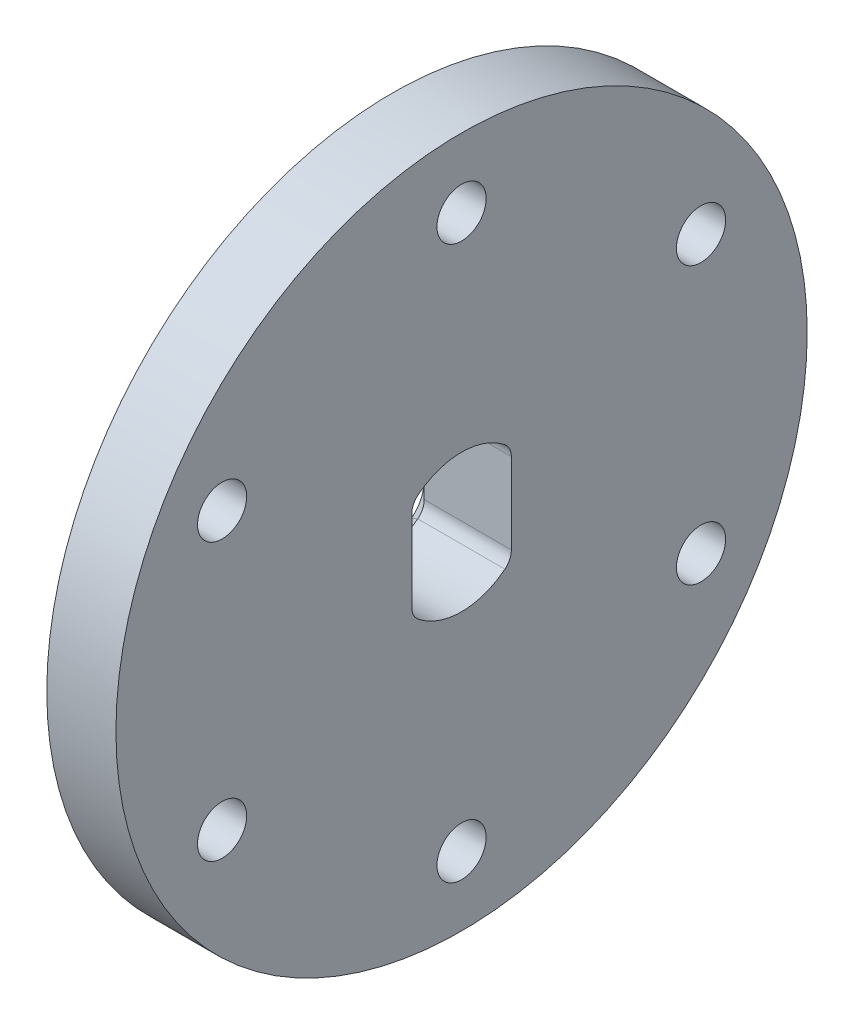
ISO-10303-21;
HEADER;
FILE_DESCRIPTION(('STEP AP214'),'2;1');
FILE_NAME('part.step','',(''),(''),'','','');
FILE_SCHEMA(('AUTOMOTIVE_DESIGN { 1 0 10303 214 1 1 1 1 }'));
ENDSEC;
DATA;
#1=APPLICATION_CONTEXT('core data for automotive mechanical design processes');
#2=APPLICATION_PROTOCOL_DEFINITION('international standard','automotive_design',2000,#1);
#3=PRODUCT_CONTEXT('',#1,'mechanical');
#4=PRODUCT('Part','Part','',(#3));
#5=PRODUCT_RELATED_PRODUCT_CATEGORY('part','',(#4));
#6=PRODUCT_DEFINITION_FORMATION('','',#4);
#7=PRODUCT_DEFINITION_CONTEXT('part definition',#1,'design');
#8=PRODUCT_DEFINITION('design','',#6,#7);
#9=PRODUCT_DEFINITION_SHAPE('','',#8);
#10=(LENGTH_UNIT() NAMED_UNIT(*) SI_UNIT(.MILLI.,.METRE.));
#11=(NAMED_UNIT(*) PLANE_ANGLE_UNIT() SI_UNIT($,.RADIAN.));
#12=(NAMED_UNIT(*) SI_UNIT($,.STERADIAN.) SOLID_ANGLE_UNIT());
#13=UNCERTAINTY_MEASURE_WITH_UNIT(LENGTH_MEASURE(1.E-05),#10,'distance_accuracy_value','');
#14=(GEOMETRIC_REPRESENTATION_CONTEXT(3) GLOBAL_UNCERTAINTY_ASSIGNED_CONTEXT((#13)) GLOBAL_UNIT_ASSIGNED_CONTEXT((#10,
#11,#12)) REPRESENTATION_CONTEXT('',''));
#15=CARTESIAN_POINT('',(0.,0.,0.));
#16=DIRECTION('',(0.,0.,1.));
#17=DIRECTION('',(1.,0.,0.));
#18=AXIS2_PLACEMENT_3D('',#15,#16,#17);
#19=CARTESIAN_POINT('',(0.,0.,0.));
#20=DIRECTION('',(1.,0.,0.));
#21=DIRECTION('',(0.,0.,-1.));
#22=AXIS2_PLACEMENT_3D('',#19,#20,#21);
#23=PLANE('',#22);
#24=CARTESIAN_POINT('',(0.,0.,0.));
#25=DIRECTION('',(1.,0.,0.));
#26=DIRECTION('',(0.,0.,-1.));
#27=AXIS2_PLACEMENT_3D('',#24,#25,#26);
#28=CIRCLE('',#27,9.525);
#29=CARTESIAN_POINT('',(0.,0.,-9.525));
#30=VERTEX_POINT('',#29);
#31=EDGE_CURVE('E187',#30,#30,#28,.T.);
#32=ORIENTED_EDGE('',*,*,#31,.T.);
#33=EDGE_LOOP('',(#32));
#34=FACE_BOUND('',#33,.T.);
#35=CARTESIAN_POINT('',(0.,6.35000000000013,-10.9985226280623));
#36=DIRECTION('',(1.,0.,0.));
#37=DIRECTION('',(0.,0.,-1.));
#38=AXIS2_PLACEMENT_3D('',#35,#36,#37);
#39=CIRCLE('',#38,1.13029999999999);
#40=CARTESIAN_POINT('',(0.,6.35000000000013,-12.1288226280623));
#41=VERTEX_POINT('',#40);
#42=EDGE_CURVE('E246',#41,#41,#39,.T.);
#43=ORIENTED_EDGE('',*,*,#42,.T.);
#44=EDGE_LOOP('',(#43));
#45=FACE_BOUND('',#44,.T.);
#46=CARTESIAN_POINT('',(0.,-6.3499999999999,-10.9985226280624));
#47=DIRECTION('',(1.,0.,0.));
#48=DIRECTION('',(0.,0.,-1.));
#49=AXIS2_PLACEMENT_3D('',#46,#47,#48);
#50=CIRCLE('',#49,1.13029999999999);
#51=CARTESIAN_POINT('',(0.,-6.3499999999999,-12.1288226280624));
#52=VERTEX_POINT('',#51);
#53=EDGE_CURVE('E256',#52,#52,#50,.T.);
#54=ORIENTED_EDGE('',*,*,#53,.T.);
#55=EDGE_LOOP('',(#54));
#56=FACE_BOUND('',#55,.T.);
#57=CARTESIAN_POINT('',(0.,-12.7,0.));
#58=DIRECTION('',(1.,0.,0.));
#59=DIRECTION('',(0.,0.,-1.));
#60=AXIS2_PLACEMENT_3D('',#57,#58,#59);
#61=CIRCLE('',#60,1.13029999999999);
#62=CARTESIAN_POINT('',(0.,-12.7,-1.13029999999999));
#63=VERTEX_POINT('',#62);
#64=EDGE_CURVE('E262',#63,#63,#61,.T.);
#65=ORIENTED_EDGE('',*,*,#64,.T.);
#66=EDGE_LOOP('',(#65));
#67=FACE_BOUND('',#66,.T.);
#68=CARTESIAN_POINT('',(0.,-6.35000000000005,10.9985226280623));
#69=DIRECTION('',(1.,0.,0.));
#70=DIRECTION('',(0.,0.,-1.));
#71=AXIS2_PLACEMENT_3D('',#68,#69,#70);
#72=CIRCLE('',#71,1.13029999999999);
#73=CARTESIAN_POINT('',(0.,-6.35000000000005,9.86822262806236));
#74=VERTEX_POINT('',#73);
#75=EDGE_CURVE('E268',#74,#74,#72,.T.);
#76=ORIENTED_EDGE('',*,*,#75,.T.);
#77=EDGE_LOOP('',(#76));
#78=FACE_BOUND('',#77,.T.);
#79=CARTESIAN_POINT('',(0.,6.34999999999997,10.9985226280624));
#80=DIRECTION('',(1.,0.,0.));
#81=DIRECTION('',(0.,0.,-1.));
#82=AXIS2_PLACEMENT_3D('',#79,#80,#81);
#83=CIRCLE('',#82,1.13029999999999);
#84=CARTESIAN_POINT('',(0.,6.34999999999997,9.8682226280624));
#85=VERTEX_POINT('',#84);
#86=EDGE_CURVE('E274',#85,#85,#83,.T.);
#87=ORIENTED_EDGE('',*,*,#86,.T.);
#88=EDGE_LOOP('',(#87));
#89=FACE_BOUND('',#88,.T.);
#90=CARTESIAN_POINT('',(0.,12.7,0.));
#91=DIRECTION('',(1.,0.,0.));
#92=DIRECTION('',(0.,0.,-1.));
#93=AXIS2_PLACEMENT_3D('',#90,#91,#92);
#94=CIRCLE('',#93,1.13029999999999);
#95=CARTESIAN_POINT('',(0.,12.7,-1.13029999999999));
#96=VERTEX_POINT('',#95);
#97=EDGE_CURVE('E280',#96,#96,#94,.T.);
#98=ORIENTED_EDGE('',*,*,#97,.T.);
#99=EDGE_LOOP('',(#98));
#100=FACE_BOUND('',#99,.T.);
#101=CARTESIAN_POINT('',(0.,0.,0.));
#102=DIRECTION('',(1.,0.,0.));
#103=DIRECTION('',(0.,0.,-1.));
#104=AXIS2_PLACEMENT_3D('',#101,#102,#103);
#105=CIRCLE('',#104,15.875);
#106=CARTESIAN_POINT('',(0.,0.,-15.875));
#107=VERTEX_POINT('',#106);
#108=EDGE_CURVE('E161',#107,#107,#105,.T.);
#109=ORIENTED_EDGE('',*,*,#108,.F.);
#110=EDGE_LOOP('',(#109));
#111=FACE_BOUND('',#110,.T.);
#112=ADVANCED_FACE('F37',(#34,#45,#56,#67,#78,#89,#100,#111),#23,.F.);
#113=CARTESIAN_POINT('',(3.175,0.,0.));
#114=DIRECTION('',(-1.,0.,0.));
#115=DIRECTION('',(0.,0.,1.));
#116=AXIS2_PLACEMENT_3D('',#113,#114,#115);
#117=CYLINDRICAL_SURFACE('',#116,15.875);
#118=CARTESIAN_POINT('',(3.175,0.,0.));
#119=DIRECTION('',(1.,0.,0.));
#120=DIRECTION('',(0.,0.,-1.));
#121=AXIS2_PLACEMENT_3D('',#118,#119,#120);
#122=CIRCLE('',#121,15.875);
#123=CARTESIAN_POINT('',(3.175,0.,-15.875));
#124=VERTEX_POINT('',#123);
#125=EDGE_CURVE('E167',#124,#124,#122,.T.);
#126=ORIENTED_EDGE('',*,*,#125,.F.);
#127=EDGE_LOOP('',(#126));
#128=FACE_BOUND('',#127,.T.);
#129=ORIENTED_EDGE('',*,*,#108,.T.);
#130=EDGE_LOOP('',(#129));
#131=FACE_BOUND('',#130,.T.);
#132=ADVANCED_FACE('F320',(#128,#131),#117,.T.);
#133=CARTESIAN_POINT('',(3.175,0.,0.));
#134=DIRECTION('',(1.,0.,0.));
#135=DIRECTION('',(0.,0.,-1.));
#136=AXIS2_PLACEMENT_3D('',#133,#134,#135);
#137=PLANE('',#136);
#138=CARTESIAN_POINT('',(3.175,6.35000000000013,-10.9985226280623));
#139=DIRECTION('',(1.,0.,0.));
#140=DIRECTION('',(0.,0.,-1.));
#141=AXIS2_PLACEMENT_3D('',#138,#139,#140);
#142=CIRCLE('',#141,1.13029999999999);
#143=CARTESIAN_POINT('',(3.175,6.35000000000013,-12.1288226280623));
#144=VERTEX_POINT('',#143);
#145=EDGE_CURVE('E241',#144,#144,#142,.T.);
#146=ORIENTED_EDGE('',*,*,#145,.F.);
#147=EDGE_LOOP('',(#146));
#148=FACE_BOUND('',#147,.T.);
#149=CARTESIAN_POINT('',(3.175,-6.3499999999999,-10.9985226280624));
#150=DIRECTION('',(1.,0.,0.));
#151=DIRECTION('',(0.,0.,-1.));
#152=AXIS2_PLACEMENT_3D('',#149,#150,#151);
#153=CIRCLE('',#152,1.13029999999999);
#154=CARTESIAN_POINT('',(3.175,-6.3499999999999,-12.1288226280624));
#155=VERTEX_POINT('',#154);
#156=EDGE_CURVE('E251',#155,#155,#153,.T.);
#157=ORIENTED_EDGE('',*,*,#156,.F.);
#158=EDGE_LOOP('',(#157));
#159=FACE_BOUND('',#158,.T.);
#160=CARTESIAN_POINT('',(3.175,-12.7,0.));
#161=DIRECTION('',(1.,0.,0.));
#162=DIRECTION('',(0.,0.,-1.));
#163=AXIS2_PLACEMENT_3D('',#160,#161,#162);
#164=CIRCLE('',#163,1.13029999999999);
#165=CARTESIAN_POINT('',(3.175,-12.7,-1.13029999999999));
#166=VERTEX_POINT('',#165);
#167=EDGE_CURVE('E259',#166,#166,#164,.T.);
#168=ORIENTED_EDGE('',*,*,#167,.F.);
#169=EDGE_LOOP('',(#168));
#170=FACE_BOUND('',#169,.T.);
#171=CARTESIAN_POINT('',(3.175,-6.35000000000005,10.9985226280623));
#172=DIRECTION('',(1.,0.,0.));
#173=DIRECTION('',(0.,0.,-1.));
#174=AXIS2_PLACEMENT_3D('',#171,#172,#173);
#175=CIRCLE('',#174,1.13029999999999);
#176=CARTESIAN_POINT('',(3.175,-6.35000000000005,9.86822262806236));
#177=VERTEX_POINT('',#176);
#178=EDGE_CURVE('E265',#177,#177,#175,.T.);
#179=ORIENTED_EDGE('',*,*,#178,.F.);
#180=EDGE_LOOP('',(#179));
#181=FACE_BOUND('',#180,.T.);
#182=CARTESIAN_POINT('',(3.175,6.34999999999997,10.9985226280624));
#183=DIRECTION('',(1.,0.,0.));
#184=DIRECTION('',(0.,0.,-1.));
#185=AXIS2_PLACEMENT_3D('',#182,#183,#184);
#186=CIRCLE('',#185,1.13029999999999);
#187=CARTESIAN_POINT('',(3.175,6.34999999999997,9.8682226280624));
#188=VERTEX_POINT('',#187);
#189=EDGE_CURVE('E271',#188,#188,#186,.T.);
#190=ORIENTED_EDGE('',*,*,#189,.F.);
#191=EDGE_LOOP('',(#190));
#192=FACE_BOUND('',#191,.T.);
#193=CARTESIAN_POINT('',(3.175,12.7,0.));
#194=DIRECTION('',(1.,0.,0.));
#195=DIRECTION('',(0.,0.,-1.));
#196=AXIS2_PLACEMENT_3D('',#193,#194,#195);
#197=CIRCLE('',#196,1.13029999999999);
#198=CARTESIAN_POINT('',(3.175,12.7,-1.13029999999999));
#199=VERTEX_POINT('',#198);
#200=EDGE_CURVE('E277',#199,#199,#197,.T.);
#201=ORIENTED_EDGE('',*,*,#200,.F.);
#202=EDGE_LOOP('',(#201));
#203=FACE_BOUND('',#202,.T.);
#204=CARTESIAN_POINT('',(3.175,0.,0.));
#205=DIRECTION('',(1.,0.,0.));
#206=DIRECTION('',(0.,0.,-1.));
#207=AXIS2_PLACEMENT_3D('',#204,#205,#206);
#208=CIRCLE('',#207,3.175);
#209=CARTESIAN_POINT('',(3.175,2.47423757055695,-1.98966666666667));
#210=VERTEX_POINT('',#209);
#211=CARTESIAN_POINT('',(3.175,2.47423757055695,1.98966666666667));
#212=VERTEX_POINT('',#211);
#213=EDGE_CURVE('E283',#210,#212,#208,.T.);
#214=ORIENTED_EDGE('',*,*,#213,.F.);
#215=CARTESIAN_POINT('',(3.175,1.85567817791771,-1.49225));
#216=DIRECTION('',(1.,0.,0.));
#217=DIRECTION('',(0.,0.,-1.));
#218=AXIS2_PLACEMENT_3D('',#215,#216,#217);
#219=CIRCLE('',#218,0.79375);
#220=CARTESIAN_POINT('',(3.175,1.85567817791771,-2.286));
#221=VERTEX_POINT('',#220);
#222=EDGE_CURVE('E156',#210,#221,#219,.F.);
#223=ORIENTED_EDGE('',*,*,#222,.T.);
#224=DIRECTION('',(0.,1.,0.));
#225=VECTOR('',#224,1.);
#226=CARTESIAN_POINT('',(3.175,2.20336764975798,-2.286));
#227=LINE('',#226,#225);
#228=CARTESIAN_POINT('',(3.175,-1.85567817791771,-2.286));
#229=VERTEX_POINT('',#228);
#230=EDGE_CURVE('E133',#229,#221,#227,.T.);
#231=ORIENTED_EDGE('',*,*,#230,.F.);
#232=CARTESIAN_POINT('',(3.175,-1.85567817791771,-1.49225));
#233=DIRECTION('',(1.,0.,0.));
#234=DIRECTION('',(0.,0.,-1.));
#235=AXIS2_PLACEMENT_3D('',#232,#233,#234);
#236=CIRCLE('',#235,0.79375);
#237=CARTESIAN_POINT('',(3.175,-2.47423757055695,-1.98966666666667));
#238=VERTEX_POINT('',#237);
#239=EDGE_CURVE('E142',#229,#238,#236,.F.);
#240=ORIENTED_EDGE('',*,*,#239,.T.);
#241=CARTESIAN_POINT('',(3.175,0.,0.));
#242=DIRECTION('',(1.,0.,0.));
#243=DIRECTION('',(0.,0.,-1.));
#244=AXIS2_PLACEMENT_3D('',#241,#242,#243);
#245=CIRCLE('',#244,3.175);
#246=CARTESIAN_POINT('',(3.175,-2.47423757055695,1.98966666666667));
#247=VERTEX_POINT('',#246);
#248=EDGE_CURVE('E158',#247,#238,#245,.T.);
#249=ORIENTED_EDGE('',*,*,#248,.F.);
#250=CARTESIAN_POINT('',(3.175,-1.85567817791771,1.49225));
#251=DIRECTION('',(1.,0.,0.));
#252=DIRECTION('',(0.,0.,-1.));
#253=AXIS2_PLACEMENT_3D('',#250,#251,#252);
#254=CIRCLE('',#253,0.79375);
#255=CARTESIAN_POINT('',(3.175,-1.85567817791771,2.286));
#256=VERTEX_POINT('',#255);
#257=EDGE_CURVE('E149',#247,#256,#254,.F.);
#258=ORIENTED_EDGE('',*,*,#257,.T.);
#259=DIRECTION('',(0.,-1.,0.));
#260=VECTOR('',#259,1.);
#261=CARTESIAN_POINT('',(3.175,2.20336764975798,2.286));
#262=LINE('',#261,#260);
#263=CARTESIAN_POINT('',(3.175,1.85567817791771,2.286));
#264=VERTEX_POINT('',#263);
#265=EDGE_CURVE('E163',#264,#256,#262,.T.);
#266=ORIENTED_EDGE('',*,*,#265,.F.);
#267=CARTESIAN_POINT('',(3.175,1.85567817791771,1.49225));
#268=DIRECTION('',(1.,0.,0.));
#269=DIRECTION('',(0.,0.,-1.));
#270=AXIS2_PLACEMENT_3D('',#267,#268,#269);
#271=CIRCLE('',#270,0.79375);
#272=EDGE_CURVE('E185',#264,#212,#271,.F.);
#273=ORIENTED_EDGE('',*,*,#272,.T.);
#274=EDGE_LOOP('',(#214,#223,#231,#240,#249,#258,#266,#273));
#275=FACE_BOUND('',#274,.T.);
#276=ORIENTED_EDGE('',*,*,#125,.T.);
#277=EDGE_LOOP('',(#276));
#278=FACE_BOUND('',#277,.T.);
#279=ADVANCED_FACE('F153',(#148,#159,#170,#181,#192,#203,#275,#278),#137,.T.);
#280=CARTESIAN_POINT('',(-1.5875,0.,0.));
#281=DIRECTION('',(-1.,0.,0.));
#282=DIRECTION('',(0.,0.,1.));
#283=AXIS2_PLACEMENT_3D('',#280,#281,#282);
#284=PLANE('',#283);
#285=CARTESIAN_POINT('',(-1.5875,-1.85567817791771,-1.49225));
#286=DIRECTION('',(-1.,0.,0.));
#287=DIRECTION('',(0.,0.,1.));
#288=AXIS2_PLACEMENT_3D('',#285,#286,#287);
#289=CIRCLE('',#288,1.55574999999999);
#290=CARTESIAN_POINT('',(-1.5875,-3.06805458749061,-2.46718666666666));
#291=VERTEX_POINT('',#290);
#292=CARTESIAN_POINT('',(-1.5875,-1.85567817791771,-3.04799999999999));
#293=VERTEX_POINT('',#292);
#294=EDGE_CURVE('E200',#291,#293,#289,.F.);
#295=ORIENTED_EDGE('',*,*,#294,.T.);
#296=DIRECTION('',(0.,1.,0.));
#297=VECTOR('',#296,1.);
#298=CARTESIAN_POINT('',(-1.5875,1.85567817791771,-3.04799999999999));
#299=LINE('',#298,#297);
#300=CARTESIAN_POINT('',(-1.5875,1.85567817791771,-3.04799999999999));
#301=VERTEX_POINT('',#300);
#302=EDGE_CURVE('E204',#293,#301,#299,.T.);
#303=ORIENTED_EDGE('',*,*,#302,.T.);
#304=CARTESIAN_POINT('',(-1.5875,1.85567817791771,-1.49225));
#305=DIRECTION('',(-1.,0.,0.));
#306=DIRECTION('',(0.,0.,1.));
#307=AXIS2_PLACEMENT_3D('',#304,#305,#306);
#308=CIRCLE('',#307,1.55574999999999);
#309=CARTESIAN_POINT('',(-1.5875,3.06805458749061,-2.46718666666666));
#310=VERTEX_POINT('',#309);
#311=EDGE_CURVE('E202',#301,#310,#308,.F.);
#312=ORIENTED_EDGE('',*,*,#311,.T.);
#313=CARTESIAN_POINT('',(-1.5875,0.,0.));
#314=DIRECTION('',(-1.,0.,0.));
#315=DIRECTION('',(0.,0.,1.));
#316=AXIS2_PLACEMENT_3D('',#313,#314,#315);
#317=CIRCLE('',#316,3.93699999999999);
#318=CARTESIAN_POINT('',(-1.5875,3.06805458749061,2.46718666666666));
#319=VERTEX_POINT('',#318);
#320=EDGE_CURVE('E198',#310,#319,#317,.F.);
#321=ORIENTED_EDGE('',*,*,#320,.T.);
#322=CARTESIAN_POINT('',(-1.5875,1.85567817791771,1.49225));
#323=DIRECTION('',(-1.,0.,0.));
#324=DIRECTION('',(0.,0.,1.));
#325=AXIS2_PLACEMENT_3D('',#322,#323,#324);
#326=CIRCLE('',#325,1.55574999999999);
#327=CARTESIAN_POINT('',(-1.5875,1.85567817791771,3.04799999999999));
#328=VERTEX_POINT('',#327);
#329=EDGE_CURVE('E194',#319,#328,#326,.F.);
#330=ORIENTED_EDGE('',*,*,#329,.T.);
#331=DIRECTION('',(0.,-1.,0.));
#332=VECTOR('',#331,1.);
#333=CARTESIAN_POINT('',(-1.5875,-1.85567817791771,3.04799999999999));
#334=LINE('',#333,#332);
#335=CARTESIAN_POINT('',(-1.5875,-1.85567817791771,3.04799999999999));
#336=VERTEX_POINT('',#335);
#337=EDGE_CURVE('E190',#328,#336,#334,.T.);
#338=ORIENTED_EDGE('',*,*,#337,.T.);
#339=CARTESIAN_POINT('',(-1.5875,-1.85567817791771,1.49225));
#340=DIRECTION('',(-1.,0.,0.));
#341=DIRECTION('',(0.,0.,1.));
#342=AXIS2_PLACEMENT_3D('',#339,#340,#341);
#343=CIRCLE('',#342,1.55574999999999);
#344=CARTESIAN_POINT('',(-1.5875,-3.06805458749061,2.46718666666666));
#345=VERTEX_POINT('',#344);
#346=EDGE_CURVE('E192',#336,#345,#343,.F.);
#347=ORIENTED_EDGE('',*,*,#346,.T.);
#348=CARTESIAN_POINT('',(-1.5875,0.,0.));
#349=DIRECTION('',(-1.,0.,0.));
#350=DIRECTION('',(0.,0.,1.));
#351=AXIS2_PLACEMENT_3D('',#348,#349,#350);
#352=CIRCLE('',#351,3.93699999999999);
#353=EDGE_CURVE('E196',#345,#291,#352,.F.);
#354=ORIENTED_EDGE('',*,*,#353,.T.);
#355=EDGE_LOOP('',(#295,#303,#312,#321,#330,#338,#347,#354));
#356=FACE_BOUND('',#355,.T.);
#357=CARTESIAN_POINT('',(-1.5875,0.,0.));
#358=DIRECTION('',(-1.,0.,0.));
#359=DIRECTION('',(0.,0.,1.));
#360=AXIS2_PLACEMENT_3D('',#357,#358,#359);
#361=CIRCLE('',#360,7.9375);
#362=CARTESIAN_POINT('',(-1.5875,0.,7.9375));
#363=VERTEX_POINT('',#362);
#364=EDGE_CURVE('E157',#363,#363,#361,.T.);
#365=ORIENTED_EDGE('',*,*,#364,.T.);
#366=EDGE_LOOP('',(#365));
#367=FACE_BOUND('',#366,.T.);
#368=ADVANCED_FACE('F306',(#356,#367),#284,.T.);
#369=CARTESIAN_POINT('',(-1.5875,0.,0.));
#370=DIRECTION('',(1.,0.,0.));
#371=DIRECTION('',(0.,0.,-1.));
#372=AXIS2_PLACEMENT_3D('',#369,#370,#371);
#373=CYLINDRICAL_SURFACE('',#372,3.175);
#374=DIRECTION('',(1.,0.,0.));
#375=VECTOR('',#374,1.);
#376=CARTESIAN_POINT('',(-1.5875,2.47423757055695,1.98966666666667));
#377=LINE('',#376,#375);
#378=CARTESIAN_POINT('',(-0.825500000000001,2.47423757055695,1.98966666666667));
#379=VERTEX_POINT('',#378);
#380=EDGE_CURVE('E179',#212,#379,#377,.F.);
#381=ORIENTED_EDGE('',*,*,#380,.T.);
#382=CARTESIAN_POINT('',(-0.825500000000001,0.,0.));
#383=DIRECTION('',(-1.,0.,0.));
#384=DIRECTION('',(0.,0.,1.));
#385=AXIS2_PLACEMENT_3D('',#382,#383,#384);
#386=CIRCLE('',#385,3.175);
#387=CARTESIAN_POINT('',(-0.825500000000001,2.47423757055695,-1.98966666666667));
#388=VERTEX_POINT('',#387);
#389=EDGE_CURVE('E212',#379,#388,#386,.T.);
#390=ORIENTED_EDGE('',*,*,#389,.T.);
#391=DIRECTION('',(1.,0.,0.));
#392=VECTOR('',#391,1.);
#393=CARTESIAN_POINT('',(-1.5875,2.47423757055695,-1.98966666666667));
#394=LINE('',#393,#392);
#395=EDGE_CURVE('E150',#388,#210,#394,.T.);
#396=ORIENTED_EDGE('',*,*,#395,.T.);
#397=ORIENTED_EDGE('',*,*,#213,.T.);
#398=EDGE_LOOP('',(#381,#390,#396,#397));
#399=FACE_BOUND('',#398,.T.);
#400=ADVANCED_FACE('F514',(#399),#373,.F.);
#401=CARTESIAN_POINT('',(-1.5875,2.20336764975798,-2.286));
#402=DIRECTION('',(0.,0.,-1.));
#403=DIRECTION('',(-1.,0.,0.));
#404=AXIS2_PLACEMENT_3D('',#401,#402,#403);
#405=PLANE('',#404);
#406=DIRECTION('',(-1.,0.,0.));
#407=VECTOR('',#406,1.);
#408=CARTESIAN_POINT('',(-1.5875,1.85567817791771,-2.286));
#409=LINE('',#408,#407);
#410=CARTESIAN_POINT('',(-0.825500000000001,1.85567817791771,-2.286));
#411=VERTEX_POINT('',#410);
#412=EDGE_CURVE('E139',#221,#411,#409,.T.);
#413=ORIENTED_EDGE('',*,*,#412,.T.);
#414=DIRECTION('',(0.,-1.,0.));
#415=VECTOR('',#414,1.);
#416=CARTESIAN_POINT('',(-0.825500000000001,-1.85567817791771,-2.286));
#417=LINE('',#416,#415);
#418=CARTESIAN_POINT('',(-0.825500000000001,-1.85567817791771,-2.286));
#419=VERTEX_POINT('',#418);
#420=EDGE_CURVE('E136',#411,#419,#417,.T.);
#421=ORIENTED_EDGE('',*,*,#420,.T.);
#422=DIRECTION('',(-1.,0.,0.));
#423=VECTOR('',#422,1.);
#424=CARTESIAN_POINT('',(3.175,-1.85567817791771,-2.286));
#425=LINE('',#424,#423);
#426=EDGE_CURVE('E128',#419,#229,#425,.F.);
#427=ORIENTED_EDGE('',*,*,#426,.T.);
#428=ORIENTED_EDGE('',*,*,#230,.T.);
#429=EDGE_LOOP('',(#413,#421,#427,#428));
#430=FACE_BOUND('',#429,.T.);
#431=ADVANCED_FACE('F131',(#430),#405,.F.);
#432=CARTESIAN_POINT('',(-1.5875,0.,0.));
#433=DIRECTION('',(1.,0.,0.));
#434=DIRECTION('',(0.,0.,-1.));
#435=AXIS2_PLACEMENT_3D('',#432,#433,#434);
#436=CYLINDRICAL_SURFACE('',#435,3.175);
#437=DIRECTION('',(1.,0.,0.));
#438=VECTOR('',#437,1.);
#439=CARTESIAN_POINT('',(-1.5875,-2.47423757055695,-1.98966666666667));
#440=LINE('',#439,#438);
#441=CARTESIAN_POINT('',(-0.825500000000001,-2.47423757055695,-1.98966666666667));
#442=VERTEX_POINT('',#441);
#443=EDGE_CURVE('E145',#238,#442,#440,.F.);
#444=ORIENTED_EDGE('',*,*,#443,.T.);
#445=CARTESIAN_POINT('',(-0.825500000000001,0.,0.));
#446=DIRECTION('',(-1.,0.,0.));
#447=DIRECTION('',(0.,0.,1.));
#448=AXIS2_PLACEMENT_3D('',#445,#446,#447);
#449=CIRCLE('',#448,3.175);
#450=CARTESIAN_POINT('',(-0.825500000000001,-2.47423757055695,1.98966666666667));
#451=VERTEX_POINT('',#450);
#452=EDGE_CURVE('E214',#442,#451,#449,.T.);
#453=ORIENTED_EDGE('',*,*,#452,.T.);
#454=DIRECTION('',(1.,0.,0.));
#455=VECTOR('',#454,1.);
#456=CARTESIAN_POINT('',(-1.5875,-2.47423757055695,1.98966666666667));
#457=LINE('',#456,#455);
#458=EDGE_CURVE('E138',#451,#247,#457,.T.);
#459=ORIENTED_EDGE('',*,*,#458,.T.);
#460=ORIENTED_EDGE('',*,*,#248,.T.);
#461=EDGE_LOOP('',(#444,#453,#459,#460));
#462=FACE_BOUND('',#461,.T.);
#463=ADVANCED_FACE('F292',(#462),#436,.F.);
#464=CARTESIAN_POINT('',(-1.5875,2.20336764975798,2.286));
#465=DIRECTION('',(0.,0.,1.));
#466=DIRECTION('',(1.,0.,0.));
#467=AXIS2_PLACEMENT_3D('',#464,#465,#466);
#468=PLANE('',#467);
#469=DIRECTION('',(-1.,0.,0.));
#470=VECTOR('',#469,1.);
#471=CARTESIAN_POINT('',(-1.5875,-1.85567817791771,2.286));
#472=LINE('',#471,#470);
#473=CARTESIAN_POINT('',(-0.825500000000001,-1.85567817791771,2.286));
#474=VERTEX_POINT('',#473);
#475=EDGE_CURVE('E177',#256,#474,#472,.T.);
#476=ORIENTED_EDGE('',*,*,#475,.T.);
#477=DIRECTION('',(0.,1.,0.));
#478=VECTOR('',#477,1.);
#479=CARTESIAN_POINT('',(-0.825500000000001,1.85567817791771,2.286));
#480=LINE('',#479,#478);
#481=CARTESIAN_POINT('',(-0.825500000000001,1.85567817791771,2.286));
#482=VERTEX_POINT('',#481);
#483=EDGE_CURVE('E11',#474,#482,#480,.T.);
#484=ORIENTED_EDGE('',*,*,#483,.T.);
#485=DIRECTION('',(-1.,0.,0.));
#486=VECTOR('',#485,1.);
#487=CARTESIAN_POINT('',(3.175,1.85567817791771,2.286));
#488=LINE('',#487,#486);
#489=EDGE_CURVE('E175',#482,#264,#488,.F.);
#490=ORIENTED_EDGE('',*,*,#489,.T.);
#491=ORIENTED_EDGE('',*,*,#265,.T.);
#492=EDGE_LOOP('',(#476,#484,#490,#491));
#493=FACE_BOUND('',#492,.T.);
#494=ADVANCED_FACE('F287',(#493),#468,.F.);
#495=CARTESIAN_POINT('',(-1.5875,-1.85567817791771,-1.49225));
#496=DIRECTION('',(1.,0.,0.));
#497=DIRECTION('',(0.,0.,-1.));
#498=AXIS2_PLACEMENT_3D('',#495,#496,#497);
#499=CYLINDRICAL_SURFACE('',#498,0.79375);
#500=ORIENTED_EDGE('',*,*,#426,.F.);
#501=CARTESIAN_POINT('',(-0.825500000000001,-1.85567817791771,-1.49225));
#502=DIRECTION('',(-1.,0.,0.));
#503=DIRECTION('',(0.,0.,1.));
#504=AXIS2_PLACEMENT_3D('',#501,#502,#503);
#505=CIRCLE('',#504,0.79375);
#506=EDGE_CURVE('E210',#419,#442,#505,.T.);
#507=ORIENTED_EDGE('',*,*,#506,.T.);
#508=ORIENTED_EDGE('',*,*,#443,.F.);
#509=ORIENTED_EDGE('',*,*,#239,.F.);
#510=EDGE_LOOP('',(#500,#507,#508,#509));
#511=FACE_BOUND('',#510,.T.);
#512=ADVANCED_FACE('F143',(#511),#499,.F.);
#513=CARTESIAN_POINT('',(-1.5875,-1.85567817791771,1.49225));
#514=DIRECTION('',(1.,0.,0.));
#515=DIRECTION('',(0.,0.,-1.));
#516=AXIS2_PLACEMENT_3D('',#513,#514,#515);
#517=CYLINDRICAL_SURFACE('',#516,0.79375);
#518=ORIENTED_EDGE('',*,*,#458,.F.);
#519=CARTESIAN_POINT('',(-0.825500000000001,-1.85567817791771,1.49225));
#520=DIRECTION('',(-1.,0.,0.));
#521=DIRECTION('',(0.,0.,1.));
#522=AXIS2_PLACEMENT_3D('',#519,#520,#521);
#523=CIRCLE('',#522,0.79375);
#524=EDGE_CURVE('E46',#451,#474,#523,.T.);
#525=ORIENTED_EDGE('',*,*,#524,.T.);
#526=ORIENTED_EDGE('',*,*,#475,.F.);
#527=ORIENTED_EDGE('',*,*,#257,.F.);
#528=EDGE_LOOP('',(#518,#525,#526,#527));
#529=FACE_BOUND('',#528,.T.);
#530=ADVANCED_FACE('F290',(#529),#517,.F.);
#531=CARTESIAN_POINT('',(-1.5875,1.85567817791771,-1.49225));
#532=DIRECTION('',(1.,0.,0.));
#533=DIRECTION('',(0.,0.,-1.));
#534=AXIS2_PLACEMENT_3D('',#531,#532,#533);
#535=CYLINDRICAL_SURFACE('',#534,0.79375);
#536=ORIENTED_EDGE('',*,*,#395,.F.);
#537=CARTESIAN_POINT('',(-0.825500000000001,1.85567817791771,-1.49225));
#538=DIRECTION('',(-1.,0.,0.));
#539=DIRECTION('',(0.,0.,1.));
#540=AXIS2_PLACEMENT_3D('',#537,#538,#539);
#541=CIRCLE('',#540,0.79375);
#542=EDGE_CURVE('E208',#388,#411,#541,.T.);
#543=ORIENTED_EDGE('',*,*,#542,.T.);
#544=ORIENTED_EDGE('',*,*,#412,.F.);
#545=ORIENTED_EDGE('',*,*,#222,.F.);
#546=EDGE_LOOP('',(#536,#543,#544,#545));
#547=FACE_BOUND('',#546,.T.);
#548=ADVANCED_FACE('F336',(#547),#535,.F.);
#549=CARTESIAN_POINT('',(-1.5875,1.85567817791771,1.49225));
#550=DIRECTION('',(1.,0.,0.));
#551=DIRECTION('',(0.,0.,-1.));
#552=AXIS2_PLACEMENT_3D('',#549,#550,#551);
#553=CYLINDRICAL_SURFACE('',#552,0.79375);
#554=ORIENTED_EDGE('',*,*,#489,.F.);
#555=CARTESIAN_POINT('',(-0.825500000000001,1.85567817791771,1.49225));
#556=DIRECTION('',(-1.,0.,0.));
#557=DIRECTION('',(0.,0.,1.));
#558=AXIS2_PLACEMENT_3D('',#555,#556,#557);
#559=CIRCLE('',#558,0.79375);
#560=EDGE_CURVE('E216',#482,#379,#559,.T.);
#561=ORIENTED_EDGE('',*,*,#560,.T.);
#562=ORIENTED_EDGE('',*,*,#380,.F.);
#563=ORIENTED_EDGE('',*,*,#272,.F.);
#564=EDGE_LOOP('',(#554,#561,#562,#563));
#565=FACE_BOUND('',#564,.T.);
#566=ADVANCED_FACE('F339',(#565),#553,.F.);
#567=CARTESIAN_POINT('',(3.175,12.7,0.));
#568=DIRECTION('',(1.,0.,0.));
#569=DIRECTION('',(0.,0.,-1.));
#570=AXIS2_PLACEMENT_3D('',#567,#568,#569);
#571=CYLINDRICAL_SURFACE('',#570,1.13029999999999);
#572=ORIENTED_EDGE('',*,*,#200,.T.);
#573=EDGE_LOOP('',(#572));
#574=FACE_BOUND('',#573,.T.);
#575=ORIENTED_EDGE('',*,*,#97,.F.);
#576=EDGE_LOOP('',(#575));
#577=FACE_BOUND('',#576,.T.);
#578=ADVANCED_FACE('F343',(#574,#577),#571,.F.);
#579=CARTESIAN_POINT('',(3.175,6.34999999999997,10.9985226280624));
#580=DIRECTION('',(1.,0.,0.));
#581=DIRECTION('',(0.,0.,-1.));
#582=AXIS2_PLACEMENT_3D('',#579,#580,#581);
#583=CYLINDRICAL_SURFACE('',#582,1.13029999999999);
#584=ORIENTED_EDGE('',*,*,#189,.T.);
#585=EDGE_LOOP('',(#584));
#586=FACE_BOUND('',#585,.T.);
#587=ORIENTED_EDGE('',*,*,#86,.F.);
#588=EDGE_LOOP('',(#587));
#589=FACE_BOUND('',#588,.T.);
#590=ADVANCED_FACE('F450',(#586,#589),#583,.F.);
#591=CARTESIAN_POINT('',(3.175,-6.35000000000005,10.9985226280623));
#592=DIRECTION('',(1.,0.,0.));
#593=DIRECTION('',(0.,0.,-1.));
#594=AXIS2_PLACEMENT_3D('',#591,#592,#593);
#595=CYLINDRICAL_SURFACE('',#594,1.13029999999999);
#596=ORIENTED_EDGE('',*,*,#178,.T.);
#597=EDGE_LOOP('',(#596));
#598=FACE_BOUND('',#597,.T.);
#599=ORIENTED_EDGE('',*,*,#75,.F.);
#600=EDGE_LOOP('',(#599));
#601=FACE_BOUND('',#600,.T.);
#602=ADVANCED_FACE('F440',(#598,#601),#595,.F.);
#603=CARTESIAN_POINT('',(3.175,-12.7,0.));
#604=DIRECTION('',(1.,0.,0.));
#605=DIRECTION('',(0.,0.,-1.));
#606=AXIS2_PLACEMENT_3D('',#603,#604,#605);
#607=CYLINDRICAL_SURFACE('',#606,1.13029999999999);
#608=ORIENTED_EDGE('',*,*,#167,.T.);
#609=EDGE_LOOP('',(#608));
#610=FACE_BOUND('',#609,.T.);
#611=ORIENTED_EDGE('',*,*,#64,.F.);
#612=EDGE_LOOP('',(#611));
#613=FACE_BOUND('',#612,.T.);
#614=ADVANCED_FACE('F430',(#610,#613),#607,.F.);
#615=CARTESIAN_POINT('',(3.175,-6.3499999999999,-10.9985226280624));
#616=DIRECTION('',(1.,0.,0.));
#617=DIRECTION('',(0.,0.,-1.));
#618=AXIS2_PLACEMENT_3D('',#615,#616,#617);
#619=CYLINDRICAL_SURFACE('',#618,1.13029999999999);
#620=ORIENTED_EDGE('',*,*,#156,.T.);
#621=EDGE_LOOP('',(#620));
#622=FACE_BOUND('',#621,.T.);
#623=ORIENTED_EDGE('',*,*,#53,.F.);
#624=EDGE_LOOP('',(#623));
#625=FACE_BOUND('',#624,.T.);
#626=ADVANCED_FACE('F421',(#622,#625),#619,.F.);
#627=CARTESIAN_POINT('',(3.175,6.35000000000013,-10.9985226280623));
#628=DIRECTION('',(1.,0.,0.));
#629=DIRECTION('',(0.,0.,-1.));
#630=AXIS2_PLACEMENT_3D('',#627,#628,#629);
#631=CYLINDRICAL_SURFACE('',#630,1.13029999999999);
#632=ORIENTED_EDGE('',*,*,#145,.T.);
#633=EDGE_LOOP('',(#632));
#634=FACE_BOUND('',#633,.T.);
#635=ORIENTED_EDGE('',*,*,#42,.F.);
#636=EDGE_LOOP('',(#635));
#637=FACE_BOUND('',#636,.T.);
#638=ADVANCED_FACE('F347',(#634,#637),#631,.F.);
#639=CARTESIAN_POINT('',(-1.5875,0.,0.));
#640=DIRECTION('',(1.,0.,0.));
#641=DIRECTION('',(0.,0.,-1.));
#642=AXIS2_PLACEMENT_3D('',#639,#640,#641);
#643=TOROIDAL_SURFACE('',#642,9.525,1.5875);
#644=ORIENTED_EDGE('',*,*,#31,.F.);
#645=EDGE_LOOP('',(#644));
#646=FACE_BOUND('',#645,.T.);
#647=ORIENTED_EDGE('',*,*,#364,.F.);
#648=EDGE_LOOP('',(#647));
#649=FACE_BOUND('',#648,.T.);
#650=ADVANCED_FACE('F317',(#646,#649),#643,.F.);
#651=CARTESIAN_POINT('',(-1.5875,0.,3.04799999999999));
#652=DIRECTION('',(-0.707106781186544,0.,-0.707106781186551));
#653=DIRECTION('',(-0.707106781186551,0.,0.707106781186544));
#654=AXIS2_PLACEMENT_3D('',#651,#652,#653);
#655=PLANE('',#654);
#656=DIRECTION('',(-0.707106781186551,0.,0.707106781186544));
#657=VECTOR('',#656,1.);
#658=CARTESIAN_POINT('',(-0.825500000000001,1.85567817791771,2.286));
#659=LINE('',#658,#657);
#660=EDGE_CURVE('E234',#482,#328,#659,.T.);
#661=ORIENTED_EDGE('',*,*,#660,.F.);
#662=ORIENTED_EDGE('',*,*,#483,.F.);
#663=DIRECTION('',(0.707106781186551,0.,-0.707106781186544));
#664=VECTOR('',#663,1.);
#665=CARTESIAN_POINT('',(-1.5875,-1.85567817791771,3.04799999999999));
#666=LINE('',#665,#664);
#667=EDGE_CURVE('E41',#336,#474,#666,.T.);
#668=ORIENTED_EDGE('',*,*,#667,.F.);
#669=ORIENTED_EDGE('',*,*,#337,.F.);
#670=EDGE_LOOP('',(#661,#662,#668,#669));
#671=FACE_BOUND('',#670,.T.);
#672=ADVANCED_FACE('F39',(#671),#655,.T.);
#673=CARTESIAN_POINT('',(-1.5875,-1.85567817791771,1.49225));
#674=DIRECTION('',(-1.,0.,0.));
#675=DIRECTION('',(0.,0.,1.));
#676=AXIS2_PLACEMENT_3D('',#673,#674,#675);
#677=CONICAL_SURFACE('',#676,1.55574999999999,0.785398163397444);
#678=ORIENTED_EDGE('',*,*,#667,.T.);
#679=ORIENTED_EDGE('',*,*,#524,.F.);
#680=DIRECTION('',(0.707106781186551,0.55103942186058,-0.443120249543567));
#681=VECTOR('',#680,1.);
#682=CARTESIAN_POINT('',(-1.5875,-3.06805458749061,2.46718666666666));
#683=LINE('',#682,#681);
#684=EDGE_CURVE('E232',#345,#451,#683,.T.);
#685=ORIENTED_EDGE('',*,*,#684,.F.);
#686=ORIENTED_EDGE('',*,*,#346,.F.);
#687=EDGE_LOOP('',(#678,#679,#685,#686));
#688=FACE_BOUND('',#687,.T.);
#689=ADVANCED_FACE('F309',(#688),#677,.F.);
#690=CARTESIAN_POINT('',(-1.5875,1.85567817791771,1.49225));
#691=DIRECTION('',(-1.,0.,0.));
#692=DIRECTION('',(0.,0.,1.));
#693=AXIS2_PLACEMENT_3D('',#690,#691,#692);
#694=CONICAL_SURFACE('',#693,1.55574999999999,0.785398163397444);
#695=ORIENTED_EDGE('',*,*,#660,.T.);
#696=ORIENTED_EDGE('',*,*,#329,.F.);
#697=DIRECTION('',(-0.707106781186551,0.55103942186058,0.443120249543567));
#698=VECTOR('',#697,1.);
#699=CARTESIAN_POINT('',(-0.825500000000001,2.47423757055695,1.98966666666667));
#700=LINE('',#699,#698);
#701=EDGE_CURVE('E229',#379,#319,#700,.T.);
#702=ORIENTED_EDGE('',*,*,#701,.F.);
#703=ORIENTED_EDGE('',*,*,#560,.F.);
#704=EDGE_LOOP('',(#695,#696,#702,#703));
#705=FACE_BOUND('',#704,.T.);
#706=ADVANCED_FACE('F311',(#705),#694,.F.);
#707=CARTESIAN_POINT('',(-1.5875,0.,0.));
#708=DIRECTION('',(-1.,0.,0.));
#709=DIRECTION('',(0.,0.,1.));
#710=AXIS2_PLACEMENT_3D('',#707,#708,#709);
#711=CONICAL_SURFACE('',#710,3.93699999999999,0.785398163397444);
#712=ORIENTED_EDGE('',*,*,#684,.T.);
#713=ORIENTED_EDGE('',*,*,#452,.F.);
#714=DIRECTION('',(0.707106781186551,0.55103942186058,0.443120249543568));
#715=VECTOR('',#714,1.);
#716=CARTESIAN_POINT('',(-1.5875,-3.06805458749061,-2.46718666666666));
#717=LINE('',#716,#715);
#718=EDGE_CURVE('E226',#291,#442,#717,.T.);
#719=ORIENTED_EDGE('',*,*,#718,.F.);
#720=ORIENTED_EDGE('',*,*,#353,.F.);
#721=EDGE_LOOP('',(#712,#713,#719,#720));
#722=FACE_BOUND('',#721,.T.);
#723=ADVANCED_FACE('F296',(#722),#711,.F.);
#724=CARTESIAN_POINT('',(-1.5875,0.,0.));
#725=DIRECTION('',(-1.,0.,0.));
#726=DIRECTION('',(0.,0.,1.));
#727=AXIS2_PLACEMENT_3D('',#724,#725,#726);
#728=CONICAL_SURFACE('',#727,3.93699999999999,0.785398163397444);
#729=ORIENTED_EDGE('',*,*,#701,.T.);
#730=ORIENTED_EDGE('',*,*,#320,.F.);
#731=DIRECTION('',(-0.707106781186551,0.55103942186058,-0.443120249543568));
#732=VECTOR('',#731,1.);
#733=CARTESIAN_POINT('',(-0.825500000000001,2.47423757055695,-1.98966666666667));
#734=LINE('',#733,#732);
#735=EDGE_CURVE('E223',#388,#310,#734,.T.);
#736=ORIENTED_EDGE('',*,*,#735,.F.);
#737=ORIENTED_EDGE('',*,*,#389,.F.);
#738=EDGE_LOOP('',(#729,#730,#736,#737));
#739=FACE_BOUND('',#738,.T.);
#740=ADVANCED_FACE('F359',(#739),#728,.F.);
#741=CARTESIAN_POINT('',(-1.5875,-1.85567817791771,-1.49225));
#742=DIRECTION('',(-1.,0.,0.));
#743=DIRECTION('',(0.,0.,1.));
#744=AXIS2_PLACEMENT_3D('',#741,#742,#743);
#745=CONICAL_SURFACE('',#744,1.55574999999999,0.785398163397444);
#746=ORIENTED_EDGE('',*,*,#718,.T.);
#747=ORIENTED_EDGE('',*,*,#506,.F.);
#748=DIRECTION('',(0.707106781186551,0.,0.707106781186544));
#749=VECTOR('',#748,1.);
#750=CARTESIAN_POINT('',(-1.5875,-1.85567817791771,-3.04799999999999));
#751=LINE('',#750,#749);
#752=EDGE_CURVE('E221',#293,#419,#751,.T.);
#753=ORIENTED_EDGE('',*,*,#752,.F.);
#754=ORIENTED_EDGE('',*,*,#294,.F.);
#755=EDGE_LOOP('',(#746,#747,#753,#754));
#756=FACE_BOUND('',#755,.T.);
#757=ADVANCED_FACE('F302',(#756),#745,.F.);
#758=CARTESIAN_POINT('',(-1.5875,1.85567817791771,-1.49225));
#759=DIRECTION('',(-1.,0.,0.));
#760=DIRECTION('',(0.,0.,1.));
#761=AXIS2_PLACEMENT_3D('',#758,#759,#760);
#762=CONICAL_SURFACE('',#761,1.55574999999999,0.785398163397444);
#763=ORIENTED_EDGE('',*,*,#735,.T.);
#764=ORIENTED_EDGE('',*,*,#311,.F.);
#765=DIRECTION('',(-0.707106781186551,0.,-0.707106781186544));
#766=VECTOR('',#765,1.);
#767=CARTESIAN_POINT('',(-0.825500000000001,1.85567817791771,-2.286));
#768=LINE('',#767,#766);
#769=EDGE_CURVE('E219',#411,#301,#768,.T.);
#770=ORIENTED_EDGE('',*,*,#769,.F.);
#771=ORIENTED_EDGE('',*,*,#542,.F.);
#772=EDGE_LOOP('',(#763,#764,#770,#771));
#773=FACE_BOUND('',#772,.T.);
#774=ADVANCED_FACE('F352',(#773),#762,.F.);
#775=CARTESIAN_POINT('',(-1.5875,0.,-3.04799999999999));
#776=DIRECTION('',(-0.707106781186544,0.,0.707106781186551));
#777=DIRECTION('',(0.707106781186551,0.,0.707106781186544));
#778=AXIS2_PLACEMENT_3D('',#775,#776,#777);
#779=PLANE('',#778);
#780=ORIENTED_EDGE('',*,*,#752,.T.);
#781=ORIENTED_EDGE('',*,*,#420,.F.);
#782=ORIENTED_EDGE('',*,*,#769,.T.);
#783=ORIENTED_EDGE('',*,*,#302,.F.);
#784=EDGE_LOOP('',(#780,#781,#782,#783));
#785=FACE_BOUND('',#784,.T.);
#786=ADVANCED_FACE('F349',(#785),#779,.T.);
#787=CLOSED_SHELL('',(#112,#132,#279,#368,#400,#431,#463,#494,#512,#530,#548,#566,#578,#590,
#602,#614,#626,#638,#650,#672,#689,#706,#723,#740,#757,#774,#786));
#788=MANIFOLD_SOLID_BREP('B2',#787);
#789=ADVANCED_BREP_SHAPE_REPRESENTATION('',(#18,#788),#14);
#790=SHAPE_DEFINITION_REPRESENTATION(#9,#789);
ENDSEC;
END-ISO-10303-21;
